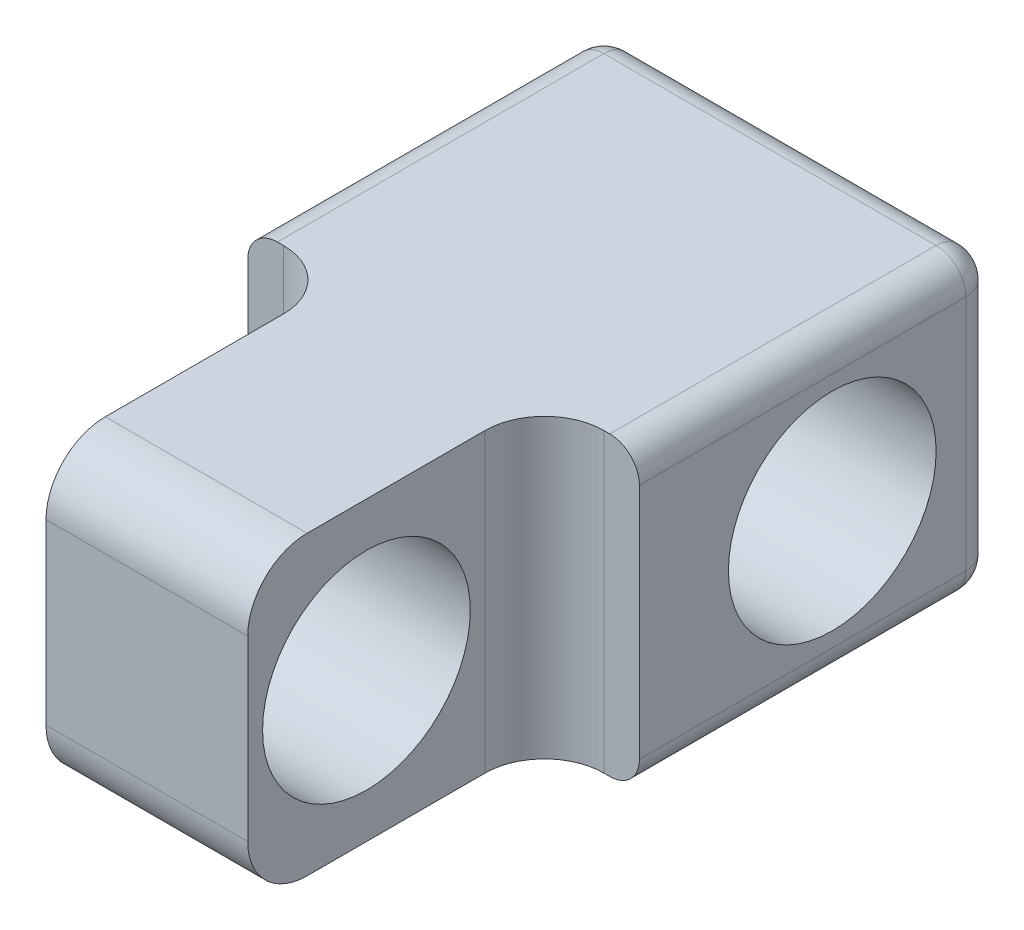
ISO-10303-21;
HEADER;
FILE_DESCRIPTION(('STEP AP214'),'2;1');
FILE_NAME('part.step','',(''),(''),'','','');
FILE_SCHEMA(('AUTOMOTIVE_DESIGN { 1 0 10303 214 1 1 1 1 }'));
ENDSEC;
DATA;
#1=APPLICATION_CONTEXT('core data for automotive mechanical design processes');
#2=APPLICATION_PROTOCOL_DEFINITION('international standard','automotive_design',2000,#1);
#3=PRODUCT_CONTEXT('',#1,'mechanical');
#4=PRODUCT('Part','Part','',(#3));
#5=PRODUCT_RELATED_PRODUCT_CATEGORY('part','',(#4));
#6=PRODUCT_DEFINITION_FORMATION('','',#4);
#7=PRODUCT_DEFINITION_CONTEXT('part definition',#1,'design');
#8=PRODUCT_DEFINITION('design','',#6,#7);
#9=PRODUCT_DEFINITION_SHAPE('','',#8);
#10=(LENGTH_UNIT() NAMED_UNIT(*) SI_UNIT(.MILLI.,.METRE.));
#11=(NAMED_UNIT(*) PLANE_ANGLE_UNIT() SI_UNIT($,.RADIAN.));
#12=(NAMED_UNIT(*) SI_UNIT($,.STERADIAN.) SOLID_ANGLE_UNIT());
#13=UNCERTAINTY_MEASURE_WITH_UNIT(LENGTH_MEASURE(1.E-05),#10,'distance_accuracy_value','');
#14=(GEOMETRIC_REPRESENTATION_CONTEXT(3) GLOBAL_UNCERTAINTY_ASSIGNED_CONTEXT((#13)) GLOBAL_UNIT_ASSIGNED_CONTEXT((#10,
#11,#12)) REPRESENTATION_CONTEXT('',''));
#15=CARTESIAN_POINT('',(0.,0.,0.));
#16=DIRECTION('',(0.,0.,1.));
#17=DIRECTION('',(1.,0.,0.));
#18=AXIS2_PLACEMENT_3D('',#15,#16,#17);
#19=CARTESIAN_POINT('',(6.1,4.5,6.));
#20=DIRECTION('',(0.,0.,-1.));
#21=DIRECTION('',(-1.,0.,0.));
#22=AXIS2_PLACEMENT_3D('',#19,#20,#21);
#23=PLANE('',#22);
#24=DIRECTION('',(-1.,0.,0.));
#25=VECTOR('',#24,1.);
#26=CARTESIAN_POINT('',(0.500000000000004,5.,6.));
#27=LINE('',#26,#25);
#28=CARTESIAN_POINT('',(6.1,5.,6.));
#29=VERTEX_POINT('',#28);
#30=CARTESIAN_POINT('',(6.,5.,6.));
#31=VERTEX_POINT('',#30);
#32=EDGE_CURVE('E160',#29,#31,#27,.T.);
#33=ORIENTED_EDGE('',*,*,#32,.T.);
#34=DIRECTION('',(0.,1.,0.));
#35=VECTOR('',#34,1.);
#36=CARTESIAN_POINT('',(6.,0.,6.));
#37=LINE('',#36,#35);
#38=CARTESIAN_POINT('',(6.,0.,6.));
#39=VERTEX_POINT('',#38);
#40=EDGE_CURVE('E243',#31,#39,#37,.F.);
#41=ORIENTED_EDGE('',*,*,#40,.T.);
#42=DIRECTION('',(1.,0.,0.));
#43=VECTOR('',#42,1.);
#44=CARTESIAN_POINT('',(0.500000000000004,0.,6.));
#45=LINE('',#44,#43);
#46=CARTESIAN_POINT('',(6.1,0.,6.));
#47=VERTEX_POINT('',#46);
#48=EDGE_CURVE('E309',#39,#47,#45,.T.);
#49=ORIENTED_EDGE('',*,*,#48,.T.);
#50=CARTESIAN_POINT('',(6.1,0.5,6.));
#51=DIRECTION('',(0.,0.,1.));
#52=DIRECTION('',(-1.,0.,0.));
#53=AXIS2_PLACEMENT_3D('',#50,#51,#52);
#54=CIRCLE('',#53,0.5);
#55=CARTESIAN_POINT('',(6.6,0.500000000000003,6.));
#56=VERTEX_POINT('',#55);
#57=EDGE_CURVE('E313',#47,#56,#54,.T.);
#58=ORIENTED_EDGE('',*,*,#57,.T.);
#59=DIRECTION('',(0.,1.,0.));
#60=VECTOR('',#59,1.);
#61=CARTESIAN_POINT('',(6.6,0.500000000000004,6.));
#62=LINE('',#61,#60);
#63=CARTESIAN_POINT('',(6.6,4.5,6.));
#64=VERTEX_POINT('',#63);
#65=EDGE_CURVE('E175',#56,#64,#62,.T.);
#66=ORIENTED_EDGE('',*,*,#65,.T.);
#67=CARTESIAN_POINT('',(6.1,4.5,6.));
#68=DIRECTION('',(0.,0.,1.));
#69=DIRECTION('',(-1.,0.,0.));
#70=AXIS2_PLACEMENT_3D('',#67,#68,#69);
#71=CIRCLE('',#70,0.5);
#72=EDGE_CURVE('E173',#64,#29,#71,.T.);
#73=ORIENTED_EDGE('',*,*,#72,.T.);
#74=EDGE_LOOP('',(#33,#41,#49,#58,#66,#73));
#75=FACE_BOUND('',#74,.T.);
#76=ADVANCED_FACE('F35',(#75),#23,.F.);
#77=CARTESIAN_POINT('',(0.500000000000004,0.,6.));
#78=VERTEX_POINT('',#77);
#79=CARTESIAN_POINT('',(0.599999999999999,0.,6.));
#80=VERTEX_POINT('',#79);
#81=EDGE_CURVE('E310',#78,#80,#45,.T.);
#82=ORIENTED_EDGE('',*,*,#81,.T.);
#83=DIRECTION('',(0.,-1.,0.));
#84=VECTOR('',#83,1.);
#85=CARTESIAN_POINT('',(0.599999999999999,5.,6.));
#86=LINE('',#85,#84);
#87=CARTESIAN_POINT('',(0.599999999999999,5.,6.));
#88=VERTEX_POINT('',#87);
#89=EDGE_CURVE('E248',#80,#88,#86,.F.);
#90=ORIENTED_EDGE('',*,*,#89,.T.);
#91=CARTESIAN_POINT('',(0.500000000000004,5.,6.));
#92=VERTEX_POINT('',#91);
#93=EDGE_CURVE('E170',#88,#92,#27,.T.);
#94=ORIENTED_EDGE('',*,*,#93,.T.);
#95=CARTESIAN_POINT('',(0.5,4.5,6.));
#96=DIRECTION('',(0.,0.,1.));
#97=DIRECTION('',(1.,0.,0.));
#98=AXIS2_PLACEMENT_3D('',#95,#96,#97);
#99=CIRCLE('',#98,0.5);
#100=CARTESIAN_POINT('',(0.,4.5,6.));
#101=VERTEX_POINT('',#100);
#102=EDGE_CURVE('E169',#92,#101,#99,.T.);
#103=ORIENTED_EDGE('',*,*,#102,.T.);
#104=DIRECTION('',(0.,-1.,0.));
#105=VECTOR('',#104,1.);
#106=CARTESIAN_POINT('',(0.,0.500000000000004,6.));
#107=LINE('',#106,#105);
#108=CARTESIAN_POINT('',(0.,0.500000000000004,6.));
#109=VERTEX_POINT('',#108);
#110=EDGE_CURVE('E305',#101,#109,#107,.T.);
#111=ORIENTED_EDGE('',*,*,#110,.T.);
#112=CARTESIAN_POINT('',(0.5,0.5,6.));
#113=DIRECTION('',(0.,0.,1.));
#114=DIRECTION('',(-1.,0.,0.));
#115=AXIS2_PLACEMENT_3D('',#112,#113,#114);
#116=CIRCLE('',#115,0.5);
#117=EDGE_CURVE('E307',#109,#78,#116,.T.);
#118=ORIENTED_EDGE('',*,*,#117,.T.);
#119=EDGE_LOOP('',(#82,#90,#94,#103,#111,#118));
#120=FACE_BOUND('',#119,.T.);
#121=ADVANCED_FACE('F366',(#120),#23,.F.);
#122=CARTESIAN_POINT('',(6.1,4.5,6.));
#123=DIRECTION('',(0.,0.,-1.));
#124=DIRECTION('',(-1.,0.,0.));
#125=AXIS2_PLACEMENT_3D('',#122,#123,#124);
#126=CYLINDRICAL_SURFACE('',#125,0.5);
#127=DIRECTION('',(0.,0.,-1.));
#128=VECTOR('',#127,1.);
#129=CARTESIAN_POINT('',(6.6,4.5,6.));
#130=LINE('',#129,#128);
#131=CARTESIAN_POINT('',(6.6,4.5,0.5));
#132=VERTEX_POINT('',#131);
#133=EDGE_CURVE('E316',#64,#132,#130,.T.);
#134=ORIENTED_EDGE('',*,*,#133,.T.);
#135=CARTESIAN_POINT('',(6.1,4.5,0.5));
#136=DIRECTION('',(0.,0.,-1.));
#137=DIRECTION('',(-1.,0.,0.));
#138=AXIS2_PLACEMENT_3D('',#135,#136,#137);
#139=CIRCLE('',#138,0.5);
#140=CARTESIAN_POINT('',(6.1,5.,0.5));
#141=VERTEX_POINT('',#140);
#142=EDGE_CURVE('E184',#132,#141,#139,.F.);
#143=ORIENTED_EDGE('',*,*,#142,.T.);
#144=DIRECTION('',(0.,0.,-1.));
#145=VECTOR('',#144,1.);
#146=CARTESIAN_POINT('',(6.1,5.,6.));
#147=LINE('',#146,#145);
#148=EDGE_CURVE('E164',#29,#141,#147,.T.);
#149=ORIENTED_EDGE('',*,*,#148,.F.);
#150=ORIENTED_EDGE('',*,*,#72,.F.);
#151=EDGE_LOOP('',(#134,#143,#149,#150));
#152=FACE_BOUND('',#151,.T.);
#153=ADVANCED_FACE('F182',(#152),#126,.T.);
#154=CARTESIAN_POINT('',(0.500000000000004,5.,6.));
#155=DIRECTION('',(0.,-1.,0.));
#156=DIRECTION('',(0.,0.,-1.));
#157=AXIS2_PLACEMENT_3D('',#154,#155,#156);
#158=PLANE('',#157);
#159=DIRECTION('',(0.,0.,-1.));
#160=VECTOR('',#159,1.);
#161=CARTESIAN_POINT('',(1.6,5.,11.));
#162=LINE('',#161,#160);
#163=CARTESIAN_POINT('',(1.6,5.,10.));
#164=VERTEX_POINT('',#163);
#165=CARTESIAN_POINT('',(1.6,5.,7.));
#166=VERTEX_POINT('',#165);
#167=EDGE_CURVE('E220',#164,#166,#162,.T.);
#168=ORIENTED_EDGE('',*,*,#167,.F.);
#169=DIRECTION('',(-1.,0.,0.));
#170=VECTOR('',#169,1.);
#171=CARTESIAN_POINT('',(0.500000000000004,5.,10.));
#172=LINE('',#171,#170);
#173=CARTESIAN_POINT('',(5.,5.,10.));
#174=VERTEX_POINT('',#173);
#175=EDGE_CURVE('E11',#164,#174,#172,.F.);
#176=ORIENTED_EDGE('',*,*,#175,.T.);
#177=DIRECTION('',(0.,0.,-1.));
#178=VECTOR('',#177,1.);
#179=CARTESIAN_POINT('',(5.,5.,11.));
#180=LINE('',#179,#178);
#181=CARTESIAN_POINT('',(5.,5.,7.));
#182=VERTEX_POINT('',#181);
#183=EDGE_CURVE('E293',#174,#182,#180,.T.);
#184=ORIENTED_EDGE('',*,*,#183,.T.);
#185=CARTESIAN_POINT('',(6.,5.,7.));
#186=DIRECTION('',(0.,-1.,0.));
#187=DIRECTION('',(0.,0.,-1.));
#188=AXIS2_PLACEMENT_3D('',#185,#186,#187);
#189=CIRCLE('',#188,1.);
#190=EDGE_CURVE('E166',#182,#31,#189,.T.);
#191=ORIENTED_EDGE('',*,*,#190,.T.);
#192=ORIENTED_EDGE('',*,*,#32,.F.);
#193=ORIENTED_EDGE('',*,*,#148,.T.);
#194=DIRECTION('',(-1.,0.,0.));
#195=VECTOR('',#194,1.);
#196=CARTESIAN_POINT('',(0.500000000000004,5.,0.5));
#197=LINE('',#196,#195);
#198=CARTESIAN_POINT('',(0.500000000000004,5.,0.5));
#199=VERTEX_POINT('',#198);
#200=EDGE_CURVE('E214',#141,#199,#197,.T.);
#201=ORIENTED_EDGE('',*,*,#200,.T.);
#202=DIRECTION('',(0.,0.,-1.));
#203=VECTOR('',#202,1.);
#204=CARTESIAN_POINT('',(0.500000000000004,5.,6.));
#205=LINE('',#204,#203);
#206=EDGE_CURVE('E185',#92,#199,#205,.T.);
#207=ORIENTED_EDGE('',*,*,#206,.F.);
#208=ORIENTED_EDGE('',*,*,#93,.F.);
#209=CARTESIAN_POINT('',(0.599999999999999,5.,7.));
#210=DIRECTION('',(0.,-1.,0.));
#211=DIRECTION('',(0.,0.,-1.));
#212=AXIS2_PLACEMENT_3D('',#209,#210,#211);
#213=CIRCLE('',#212,1.);
#214=EDGE_CURVE('E256',#88,#166,#213,.T.);
#215=ORIENTED_EDGE('',*,*,#214,.T.);
#216=EDGE_LOOP('',(#168,#176,#184,#191,#192,#193,#201,#207,#208,#215));
#217=FACE_BOUND('',#216,.T.);
#218=ADVANCED_FACE('F162',(#217),#158,.F.);
#219=CARTESIAN_POINT('',(0.5,4.5,6.));
#220=DIRECTION('',(0.,0.,-1.));
#221=DIRECTION('',(-1.,0.,0.));
#222=AXIS2_PLACEMENT_3D('',#219,#220,#221);
#223=CYLINDRICAL_SURFACE('',#222,0.5);
#224=ORIENTED_EDGE('',*,*,#206,.T.);
#225=CARTESIAN_POINT('',(0.5,4.5,0.5));
#226=DIRECTION('',(0.,0.,-1.));
#227=DIRECTION('',(-1.,0.,0.));
#228=AXIS2_PLACEMENT_3D('',#225,#226,#227);
#229=CIRCLE('',#228,0.5);
#230=CARTESIAN_POINT('',(0.,4.5,0.5));
#231=VERTEX_POINT('',#230);
#232=EDGE_CURVE('E212',#199,#231,#229,.F.);
#233=ORIENTED_EDGE('',*,*,#232,.T.);
#234=DIRECTION('',(0.,0.,-1.));
#235=VECTOR('',#234,1.);
#236=CARTESIAN_POINT('',(0.,4.5,6.));
#237=LINE('',#236,#235);
#238=EDGE_CURVE('E190',#101,#231,#237,.T.);
#239=ORIENTED_EDGE('',*,*,#238,.F.);
#240=ORIENTED_EDGE('',*,*,#102,.F.);
#241=EDGE_LOOP('',(#224,#233,#239,#240));
#242=FACE_BOUND('',#241,.T.);
#243=ADVANCED_FACE('F364',(#242),#223,.T.);
#244=CARTESIAN_POINT('',(0.,0.500000000000004,6.));
#245=DIRECTION('',(1.,0.,0.));
#246=DIRECTION('',(0.,0.,-1.));
#247=AXIS2_PLACEMENT_3D('',#244,#245,#246);
#248=PLANE('',#247);
#249=CARTESIAN_POINT('',(0.,2.5,2.75));
#250=DIRECTION('',(1.,0.,0.));
#251=DIRECTION('',(0.,0.,-1.));
#252=AXIS2_PLACEMENT_3D('',#249,#250,#251);
#253=CIRCLE('',#252,1.75);
#254=CARTESIAN_POINT('',(0.,2.5,1.));
#255=VERTEX_POINT('',#254);
#256=EDGE_CURVE('E179',#255,#255,#253,.T.);
#257=ORIENTED_EDGE('',*,*,#256,.T.);
#258=EDGE_LOOP('',(#257));
#259=FACE_BOUND('',#258,.T.);
#260=ORIENTED_EDGE('',*,*,#238,.T.);
#261=DIRECTION('',(0.,-1.,0.));
#262=VECTOR('',#261,1.);
#263=CARTESIAN_POINT('',(0.,0.500000000000004,0.5));
#264=LINE('',#263,#262);
#265=CARTESIAN_POINT('',(0.,0.500000000000004,0.5));
#266=VERTEX_POINT('',#265);
#267=EDGE_CURVE('E210',#231,#266,#264,.T.);
#268=ORIENTED_EDGE('',*,*,#267,.T.);
#269=DIRECTION('',(0.,0.,-1.));
#270=VECTOR('',#269,1.);
#271=CARTESIAN_POINT('',(0.,0.500000000000004,6.));
#272=LINE('',#271,#270);
#273=EDGE_CURVE('E327',#109,#266,#272,.T.);
#274=ORIENTED_EDGE('',*,*,#273,.F.);
#275=ORIENTED_EDGE('',*,*,#110,.F.);
#276=EDGE_LOOP('',(#260,#268,#274,#275));
#277=FACE_BOUND('',#276,.T.);
#278=ADVANCED_FACE('F334',(#259,#277),#248,.F.);
#279=CARTESIAN_POINT('',(0.5,0.5,6.));
#280=DIRECTION('',(0.,0.,-1.));
#281=DIRECTION('',(-1.,0.,0.));
#282=AXIS2_PLACEMENT_3D('',#279,#280,#281);
#283=CYLINDRICAL_SURFACE('',#282,0.5);
#284=ORIENTED_EDGE('',*,*,#273,.T.);
#285=CARTESIAN_POINT('',(0.5,0.5,0.5));
#286=DIRECTION('',(0.,0.,-1.));
#287=DIRECTION('',(-1.,0.,0.));
#288=AXIS2_PLACEMENT_3D('',#285,#286,#287);
#289=CIRCLE('',#288,0.5);
#290=CARTESIAN_POINT('',(0.500000000000004,0.,0.5));
#291=VERTEX_POINT('',#290);
#292=EDGE_CURVE('E208',#266,#291,#289,.F.);
#293=ORIENTED_EDGE('',*,*,#292,.T.);
#294=DIRECTION('',(0.,0.,-1.));
#295=VECTOR('',#294,1.);
#296=CARTESIAN_POINT('',(0.500000000000004,0.,6.));
#297=LINE('',#296,#295);
#298=EDGE_CURVE('E324',#78,#291,#297,.T.);
#299=ORIENTED_EDGE('',*,*,#298,.F.);
#300=ORIENTED_EDGE('',*,*,#117,.F.);
#301=EDGE_LOOP('',(#284,#293,#299,#300));
#302=FACE_BOUND('',#301,.T.);
#303=ADVANCED_FACE('F417',(#302),#283,.T.);
#304=CARTESIAN_POINT('',(0.500000000000004,0.,6.));
#305=DIRECTION('',(0.,1.,0.));
#306=DIRECTION('',(0.,0.,1.));
#307=AXIS2_PLACEMENT_3D('',#304,#305,#306);
#308=PLANE('',#307);
#309=DIRECTION('',(0.,0.,-1.));
#310=VECTOR('',#309,1.);
#311=CARTESIAN_POINT('',(5.,0.,11.));
#312=LINE('',#311,#310);
#313=CARTESIAN_POINT('',(5.,0.,10.));
#314=VERTEX_POINT('',#313);
#315=CARTESIAN_POINT('',(5.,0.,7.));
#316=VERTEX_POINT('',#315);
#317=EDGE_CURVE('E288',#314,#316,#312,.T.);
#318=ORIENTED_EDGE('',*,*,#317,.F.);
#319=DIRECTION('',(1.,0.,0.));
#320=VECTOR('',#319,1.);
#321=CARTESIAN_POINT('',(0.500000000000004,0.,10.));
#322=LINE('',#321,#320);
#323=CARTESIAN_POINT('',(1.6,0.,10.));
#324=VERTEX_POINT('',#323);
#325=EDGE_CURVE('E58',#314,#324,#322,.F.);
#326=ORIENTED_EDGE('',*,*,#325,.T.);
#327=DIRECTION('',(0.,0.,-1.));
#328=VECTOR('',#327,1.);
#329=CARTESIAN_POINT('',(1.6,0.,11.));
#330=LINE('',#329,#328);
#331=CARTESIAN_POINT('',(1.6,0.,7.));
#332=VERTEX_POINT('',#331);
#333=EDGE_CURVE('E274',#324,#332,#330,.T.);
#334=ORIENTED_EDGE('',*,*,#333,.T.);
#335=CARTESIAN_POINT('',(0.599999999999999,0.,7.));
#336=DIRECTION('',(0.,1.,0.));
#337=DIRECTION('',(0.,0.,1.));
#338=AXIS2_PLACEMENT_3D('',#335,#336,#337);
#339=CIRCLE('',#338,1.);
#340=EDGE_CURVE('E254',#332,#80,#339,.T.);
#341=ORIENTED_EDGE('',*,*,#340,.T.);
#342=ORIENTED_EDGE('',*,*,#81,.F.);
#343=ORIENTED_EDGE('',*,*,#298,.T.);
#344=DIRECTION('',(1.,0.,0.));
#345=VECTOR('',#344,1.);
#346=CARTESIAN_POINT('',(6.1,0.,0.5));
#347=LINE('',#346,#345);
#348=CARTESIAN_POINT('',(6.1,0.,0.5));
#349=VERTEX_POINT('',#348);
#350=EDGE_CURVE('E206',#291,#349,#347,.T.);
#351=ORIENTED_EDGE('',*,*,#350,.T.);
#352=DIRECTION('',(0.,0.,-1.));
#353=VECTOR('',#352,1.);
#354=CARTESIAN_POINT('',(6.1,0.,6.));
#355=LINE('',#354,#353);
#356=EDGE_CURVE('E321',#47,#349,#355,.T.);
#357=ORIENTED_EDGE('',*,*,#356,.F.);
#358=ORIENTED_EDGE('',*,*,#48,.F.);
#359=CARTESIAN_POINT('',(6.,0.,7.));
#360=DIRECTION('',(0.,1.,0.));
#361=DIRECTION('',(0.,0.,1.));
#362=AXIS2_PLACEMENT_3D('',#359,#360,#361);
#363=CIRCLE('',#362,1.);
#364=EDGE_CURVE('E251',#39,#316,#363,.T.);
#365=ORIENTED_EDGE('',*,*,#364,.T.);
#366=EDGE_LOOP('',(#318,#326,#334,#341,#342,#343,#351,#357,#358,#365));
#367=FACE_BOUND('',#366,.T.);
#368=ADVANCED_FACE('F289',(#367),#308,.F.);
#369=CARTESIAN_POINT('',(6.1,0.5,6.));
#370=DIRECTION('',(0.,0.,-1.));
#371=DIRECTION('',(-1.,0.,0.));
#372=AXIS2_PLACEMENT_3D('',#369,#370,#371);
#373=CYLINDRICAL_SURFACE('',#372,0.5);
#374=ORIENTED_EDGE('',*,*,#356,.T.);
#375=CARTESIAN_POINT('',(6.1,0.5,0.5));
#376=DIRECTION('',(0.,0.,-1.));
#377=DIRECTION('',(-1.,0.,0.));
#378=AXIS2_PLACEMENT_3D('',#375,#376,#377);
#379=CIRCLE('',#378,0.5);
#380=CARTESIAN_POINT('',(6.6,0.500000000000003,0.5));
#381=VERTEX_POINT('',#380);
#382=EDGE_CURVE('E204',#349,#381,#379,.F.);
#383=ORIENTED_EDGE('',*,*,#382,.T.);
#384=DIRECTION('',(0.,0.,-1.));
#385=VECTOR('',#384,1.);
#386=CARTESIAN_POINT('',(6.6,0.500000000000003,6.));
#387=LINE('',#386,#385);
#388=EDGE_CURVE('E318',#56,#381,#387,.T.);
#389=ORIENTED_EDGE('',*,*,#388,.F.);
#390=ORIENTED_EDGE('',*,*,#57,.F.);
#391=EDGE_LOOP('',(#374,#383,#389,#390));
#392=FACE_BOUND('',#391,.T.);
#393=ADVANCED_FACE('F410',(#392),#373,.T.);
#394=CARTESIAN_POINT('',(6.6,0.500000000000004,6.));
#395=DIRECTION('',(-1.,0.,0.));
#396=DIRECTION('',(0.,0.,1.));
#397=AXIS2_PLACEMENT_3D('',#394,#395,#396);
#398=PLANE('',#397);
#399=CARTESIAN_POINT('',(6.6,2.5,2.75));
#400=DIRECTION('',(1.,0.,0.));
#401=DIRECTION('',(0.,0.,-1.));
#402=AXIS2_PLACEMENT_3D('',#399,#400,#401);
#403=CIRCLE('',#402,1.75);
#404=CARTESIAN_POINT('',(6.6,2.5,1.));
#405=VERTEX_POINT('',#404);
#406=EDGE_CURVE('E240',#405,#405,#403,.T.);
#407=ORIENTED_EDGE('',*,*,#406,.F.);
#408=EDGE_LOOP('',(#407));
#409=FACE_BOUND('',#408,.T.);
#410=ORIENTED_EDGE('',*,*,#388,.T.);
#411=DIRECTION('',(0.,1.,0.));
#412=VECTOR('',#411,1.);
#413=CARTESIAN_POINT('',(6.6,4.5,0.5));
#414=LINE('',#413,#412);
#415=EDGE_CURVE('E187',#381,#132,#414,.T.);
#416=ORIENTED_EDGE('',*,*,#415,.T.);
#417=ORIENTED_EDGE('',*,*,#133,.F.);
#418=ORIENTED_EDGE('',*,*,#65,.F.);
#419=EDGE_LOOP('',(#410,#416,#417,#418));
#420=FACE_BOUND('',#419,.T.);
#421=ADVANCED_FACE('F407',(#409,#420),#398,.F.);
#422=CARTESIAN_POINT('',(6.1,4.5,0.));
#423=DIRECTION('',(0.,0.,-1.));
#424=DIRECTION('',(-1.,0.,0.));
#425=AXIS2_PLACEMENT_3D('',#422,#423,#424);
#426=PLANE('',#425);
#427=DIRECTION('',(-1.,0.,0.));
#428=VECTOR('',#427,1.);
#429=CARTESIAN_POINT('',(6.1,4.5,0.));
#430=LINE('',#429,#428);
#431=CARTESIAN_POINT('',(0.5,4.5,0.));
#432=VERTEX_POINT('',#431);
#433=CARTESIAN_POINT('',(6.1,4.5,0.));
#434=VERTEX_POINT('',#433);
#435=EDGE_CURVE('E195',#432,#434,#430,.F.);
#436=ORIENTED_EDGE('',*,*,#435,.T.);
#437=DIRECTION('',(0.,1.,0.));
#438=VECTOR('',#437,1.);
#439=CARTESIAN_POINT('',(6.1,0.500000000000003,0.));
#440=LINE('',#439,#438);
#441=CARTESIAN_POINT('',(6.1,0.5,0.));
#442=VERTEX_POINT('',#441);
#443=EDGE_CURVE('E201',#434,#442,#440,.F.);
#444=ORIENTED_EDGE('',*,*,#443,.T.);
#445=DIRECTION('',(1.,0.,0.));
#446=VECTOR('',#445,1.);
#447=CARTESIAN_POINT('',(0.500000000000004,0.5,0.));
#448=LINE('',#447,#446);
#449=CARTESIAN_POINT('',(0.5,0.5,0.));
#450=VERTEX_POINT('',#449);
#451=EDGE_CURVE('E199',#442,#450,#448,.F.);
#452=ORIENTED_EDGE('',*,*,#451,.T.);
#453=DIRECTION('',(0.,-1.,0.));
#454=VECTOR('',#453,1.);
#455=CARTESIAN_POINT('',(0.5,4.5,0.));
#456=LINE('',#455,#454);
#457=EDGE_CURVE('E197',#450,#432,#456,.F.);
#458=ORIENTED_EDGE('',*,*,#457,.T.);
#459=EDGE_LOOP('',(#436,#444,#452,#458));
#460=FACE_BOUND('',#459,.T.);
#461=ADVANCED_FACE('F354',(#460),#426,.T.);
#462=CARTESIAN_POINT('',(0.,2.5,2.75));
#463=DIRECTION('',(1.,0.,0.));
#464=DIRECTION('',(0.,0.,-1.));
#465=AXIS2_PLACEMENT_3D('',#462,#463,#464);
#466=CYLINDRICAL_SURFACE('',#465,1.75);
#467=ORIENTED_EDGE('',*,*,#256,.F.);
#468=EDGE_LOOP('',(#467));
#469=FACE_BOUND('',#468,.T.);
#470=ORIENTED_EDGE('',*,*,#406,.T.);
#471=EDGE_LOOP('',(#470));
#472=FACE_BOUND('',#471,.T.);
#473=ADVANCED_FACE('F404',(#469,#472),#466,.F.);
#474=CARTESIAN_POINT('',(0.5,0.5,0.5));
#475=DIRECTION('',(0.,0.,-1.));
#476=DIRECTION('',(-1.,0.,0.));
#477=AXIS2_PLACEMENT_3D('',#474,#475,#476);
#478=SPHERICAL_SURFACE('',#477,0.5);
#479=CARTESIAN_POINT('',(0.5,0.5,0.5));
#480=DIRECTION('',(0.,1.,0.));
#481=DIRECTION('',(-1.,0.,0.));
#482=AXIS2_PLACEMENT_3D('',#479,#480,#481);
#483=CIRCLE('',#482,0.5);
#484=EDGE_CURVE('E234',#450,#266,#483,.T.);
#485=ORIENTED_EDGE('',*,*,#484,.F.);
#486=CARTESIAN_POINT('',(0.5,0.5,0.5));
#487=DIRECTION('',(1.,0.,0.));
#488=DIRECTION('',(0.,1.,0.));
#489=AXIS2_PLACEMENT_3D('',#486,#487,#488);
#490=CIRCLE('',#489,0.5);
#491=EDGE_CURVE('E237',#291,#450,#490,.T.);
#492=ORIENTED_EDGE('',*,*,#491,.F.);
#493=ORIENTED_EDGE('',*,*,#292,.F.);
#494=EDGE_LOOP('',(#485,#492,#493));
#495=FACE_BOUND('',#494,.T.);
#496=ADVANCED_FACE('F447',(#495),#478,.T.);
#497=CARTESIAN_POINT('',(0.500000000000004,0.5,0.5));
#498=DIRECTION('',(-1.,0.,0.));
#499=DIRECTION('',(0.,0.,1.));
#500=AXIS2_PLACEMENT_3D('',#497,#498,#499);
#501=CYLINDRICAL_SURFACE('',#500,0.5);
#502=ORIENTED_EDGE('',*,*,#491,.T.);
#503=ORIENTED_EDGE('',*,*,#451,.F.);
#504=CARTESIAN_POINT('',(6.1,0.5,0.5));
#505=DIRECTION('',(1.,0.,0.));
#506=DIRECTION('',(0.,0.,-1.));
#507=AXIS2_PLACEMENT_3D('',#504,#505,#506);
#508=CIRCLE('',#507,0.5);
#509=EDGE_CURVE('E231',#349,#442,#508,.T.);
#510=ORIENTED_EDGE('',*,*,#509,.F.);
#511=ORIENTED_EDGE('',*,*,#350,.F.);
#512=EDGE_LOOP('',(#502,#503,#510,#511));
#513=FACE_BOUND('',#512,.T.);
#514=ADVANCED_FACE('F444',(#513),#501,.T.);
#515=CARTESIAN_POINT('',(0.5,0.500000000000004,0.5));
#516=DIRECTION('',(0.,1.,0.));
#517=DIRECTION('',(0.,0.,1.));
#518=AXIS2_PLACEMENT_3D('',#515,#516,#517);
#519=CYLINDRICAL_SURFACE('',#518,0.5);
#520=ORIENTED_EDGE('',*,*,#484,.T.);
#521=ORIENTED_EDGE('',*,*,#267,.F.);
#522=CARTESIAN_POINT('',(0.5,4.5,0.5));
#523=DIRECTION('',(0.,1.,0.));
#524=DIRECTION('',(0.,0.,1.));
#525=AXIS2_PLACEMENT_3D('',#522,#523,#524);
#526=CIRCLE('',#525,0.5);
#527=EDGE_CURVE('E228',#432,#231,#526,.T.);
#528=ORIENTED_EDGE('',*,*,#527,.F.);
#529=ORIENTED_EDGE('',*,*,#457,.F.);
#530=EDGE_LOOP('',(#520,#521,#528,#529));
#531=FACE_BOUND('',#530,.T.);
#532=ADVANCED_FACE('F340',(#531),#519,.T.);
#533=CARTESIAN_POINT('',(6.1,0.5,0.5));
#534=DIRECTION('',(0.,0.,-1.));
#535=DIRECTION('',(-1.,0.,0.));
#536=AXIS2_PLACEMENT_3D('',#533,#534,#535);
#537=SPHERICAL_SURFACE('',#536,0.5);
#538=ORIENTED_EDGE('',*,*,#382,.F.);
#539=ORIENTED_EDGE('',*,*,#509,.T.);
#540=CARTESIAN_POINT('',(6.1,0.5,0.5));
#541=DIRECTION('',(0.,1.,0.));
#542=DIRECTION('',(-1.,0.,0.));
#543=AXIS2_PLACEMENT_3D('',#540,#541,#542);
#544=CIRCLE('',#543,0.5);
#545=EDGE_CURVE('E226',#381,#442,#544,.T.);
#546=ORIENTED_EDGE('',*,*,#545,.F.);
#547=EDGE_LOOP('',(#538,#539,#546));
#548=FACE_BOUND('',#547,.T.);
#549=ADVANCED_FACE('F438',(#548),#537,.T.);
#550=CARTESIAN_POINT('',(0.5,4.5,0.5));
#551=DIRECTION('',(0.,0.,-1.));
#552=DIRECTION('',(-1.,0.,0.));
#553=AXIS2_PLACEMENT_3D('',#550,#551,#552);
#554=SPHERICAL_SURFACE('',#553,0.5);
#555=ORIENTED_EDGE('',*,*,#527,.T.);
#556=ORIENTED_EDGE('',*,*,#232,.F.);
#557=CARTESIAN_POINT('',(0.5,4.5,0.5));
#558=DIRECTION('',(1.,0.,0.));
#559=DIRECTION('',(0.,1.,0.));
#560=AXIS2_PLACEMENT_3D('',#557,#558,#559);
#561=CIRCLE('',#560,0.5);
#562=EDGE_CURVE('E223',#432,#199,#561,.T.);
#563=ORIENTED_EDGE('',*,*,#562,.F.);
#564=EDGE_LOOP('',(#555,#556,#563));
#565=FACE_BOUND('',#564,.T.);
#566=ADVANCED_FACE('F346',(#565),#554,.T.);
#567=CARTESIAN_POINT('',(6.1,0.500000000000004,0.5));
#568=DIRECTION('',(0.,-1.,0.));
#569=DIRECTION('',(0.,0.,-1.));
#570=AXIS2_PLACEMENT_3D('',#567,#568,#569);
#571=CYLINDRICAL_SURFACE('',#570,0.5);
#572=ORIENTED_EDGE('',*,*,#545,.T.);
#573=ORIENTED_EDGE('',*,*,#443,.F.);
#574=CARTESIAN_POINT('',(6.1,4.5,0.5));
#575=DIRECTION('',(0.,1.,0.));
#576=DIRECTION('',(0.,0.,1.));
#577=AXIS2_PLACEMENT_3D('',#574,#575,#576);
#578=CIRCLE('',#577,0.5);
#579=EDGE_CURVE('E219',#132,#434,#578,.T.);
#580=ORIENTED_EDGE('',*,*,#579,.F.);
#581=ORIENTED_EDGE('',*,*,#415,.F.);
#582=EDGE_LOOP('',(#572,#573,#580,#581));
#583=FACE_BOUND('',#582,.T.);
#584=ADVANCED_FACE('F357',(#583),#571,.T.);
#585=CARTESIAN_POINT('',(0.500000000000004,4.5,0.5));
#586=DIRECTION('',(1.,0.,0.));
#587=DIRECTION('',(0.,0.,-1.));
#588=AXIS2_PLACEMENT_3D('',#585,#586,#587);
#589=CYLINDRICAL_SURFACE('',#588,0.5);
#590=ORIENTED_EDGE('',*,*,#562,.T.);
#591=ORIENTED_EDGE('',*,*,#200,.F.);
#592=CARTESIAN_POINT('',(6.1,4.5,0.5));
#593=DIRECTION('',(1.,0.,0.));
#594=DIRECTION('',(0.,1.,0.));
#595=AXIS2_PLACEMENT_3D('',#592,#593,#594);
#596=CIRCLE('',#595,0.5);
#597=EDGE_CURVE('E217',#434,#141,#596,.T.);
#598=ORIENTED_EDGE('',*,*,#597,.F.);
#599=ORIENTED_EDGE('',*,*,#435,.F.);
#600=EDGE_LOOP('',(#590,#591,#598,#599));
#601=FACE_BOUND('',#600,.T.);
#602=ADVANCED_FACE('F351',(#601),#589,.T.);
#603=CARTESIAN_POINT('',(6.1,4.5,0.5));
#604=DIRECTION('',(0.,0.,-1.));
#605=DIRECTION('',(-1.,0.,0.));
#606=AXIS2_PLACEMENT_3D('',#603,#604,#605);
#607=SPHERICAL_SURFACE('',#606,0.5);
#608=ORIENTED_EDGE('',*,*,#142,.F.);
#609=ORIENTED_EDGE('',*,*,#579,.T.);
#610=ORIENTED_EDGE('',*,*,#597,.T.);
#611=EDGE_LOOP('',(#608,#609,#610));
#612=FACE_BOUND('',#611,.T.);
#613=ADVANCED_FACE('F361',(#612),#607,.T.);
#614=CARTESIAN_POINT('',(1.6,0.,11.));
#615=DIRECTION('',(1.,0.,0.));
#616=DIRECTION('',(0.,1.,0.));
#617=AXIS2_PLACEMENT_3D('',#614,#615,#616);
#618=PLANE('',#617);
#619=CARTESIAN_POINT('',(1.6,2.5,9.));
#620=DIRECTION('',(1.,0.,0.));
#621=DIRECTION('',(0.,1.,0.));
#622=AXIS2_PLACEMENT_3D('',#619,#620,#621);
#623=CIRCLE('',#622,1.75);
#624=CARTESIAN_POINT('',(1.6,4.25,9.));
#625=VERTEX_POINT('',#624);
#626=EDGE_CURVE('E283',#625,#625,#623,.T.);
#627=ORIENTED_EDGE('',*,*,#626,.T.);
#628=EDGE_LOOP('',(#627));
#629=FACE_BOUND('',#628,.T.);
#630=ORIENTED_EDGE('',*,*,#333,.F.);
#631=CARTESIAN_POINT('',(1.6,1.,10.));
#632=DIRECTION('',(1.,0.,0.));
#633=DIRECTION('',(0.,1.,0.));
#634=AXIS2_PLACEMENT_3D('',#631,#632,#633);
#635=CIRCLE('',#634,1.);
#636=CARTESIAN_POINT('',(1.6,1.,11.));
#637=VERTEX_POINT('',#636);
#638=EDGE_CURVE('E43',#324,#637,#635,.F.);
#639=ORIENTED_EDGE('',*,*,#638,.T.);
#640=DIRECTION('',(0.,-1.,0.));
#641=VECTOR('',#640,1.);
#642=CARTESIAN_POINT('',(1.6,0.,11.));
#643=LINE('',#642,#641);
#644=CARTESIAN_POINT('',(1.6,4.,11.));
#645=VERTEX_POINT('',#644);
#646=EDGE_CURVE('E273',#645,#637,#643,.T.);
#647=ORIENTED_EDGE('',*,*,#646,.F.);
#648=CARTESIAN_POINT('',(1.6,4.,10.));
#649=DIRECTION('',(1.,0.,0.));
#650=DIRECTION('',(0.,1.,0.));
#651=AXIS2_PLACEMENT_3D('',#648,#649,#650);
#652=CIRCLE('',#651,1.);
#653=EDGE_CURVE('E50',#645,#164,#652,.F.);
#654=ORIENTED_EDGE('',*,*,#653,.T.);
#655=ORIENTED_EDGE('',*,*,#167,.T.);
#656=DIRECTION('',(0.,-1.,0.));
#657=VECTOR('',#656,1.);
#658=CARTESIAN_POINT('',(1.6,0.,7.));
#659=LINE('',#658,#657);
#660=EDGE_CURVE('E245',#166,#332,#659,.T.);
#661=ORIENTED_EDGE('',*,*,#660,.T.);
#662=EDGE_LOOP('',(#630,#639,#647,#654,#655,#661));
#663=FACE_BOUND('',#662,.T.);
#664=ADVANCED_FACE('F272',(#629,#663),#618,.F.);
#665=CARTESIAN_POINT('',(5.,5.,11.));
#666=DIRECTION('',(-1.,0.,0.));
#667=DIRECTION('',(0.,-1.,0.));
#668=AXIS2_PLACEMENT_3D('',#665,#666,#667);
#669=PLANE('',#668);
#670=CARTESIAN_POINT('',(5.,2.5,9.));
#671=DIRECTION('',(1.,0.,0.));
#672=DIRECTION('',(0.,1.,0.));
#673=AXIS2_PLACEMENT_3D('',#670,#671,#672);
#674=CIRCLE('',#673,1.75);
#675=CARTESIAN_POINT('',(5.,4.25,9.));
#676=VERTEX_POINT('',#675);
#677=EDGE_CURVE('E380',#676,#676,#674,.T.);
#678=ORIENTED_EDGE('',*,*,#677,.F.);
#679=EDGE_LOOP('',(#678));
#680=FACE_BOUND('',#679,.T.);
#681=DIRECTION('',(0.,1.,0.));
#682=VECTOR('',#681,1.);
#683=CARTESIAN_POINT('',(5.,5.,11.));
#684=LINE('',#683,#682);
#685=CARTESIAN_POINT('',(5.,1.,11.));
#686=VERTEX_POINT('',#685);
#687=CARTESIAN_POINT('',(5.,4.,11.));
#688=VERTEX_POINT('',#687);
#689=EDGE_CURVE('E282',#686,#688,#684,.T.);
#690=ORIENTED_EDGE('',*,*,#689,.F.);
#691=CARTESIAN_POINT('',(5.,1.,10.));
#692=DIRECTION('',(-1.,0.,0.));
#693=DIRECTION('',(0.,-1.,0.));
#694=AXIS2_PLACEMENT_3D('',#691,#692,#693);
#695=CIRCLE('',#694,1.);
#696=EDGE_CURVE('E267',#686,#314,#695,.F.);
#697=ORIENTED_EDGE('',*,*,#696,.T.);
#698=ORIENTED_EDGE('',*,*,#317,.T.);
#699=DIRECTION('',(0.,1.,0.));
#700=VECTOR('',#699,1.);
#701=CARTESIAN_POINT('',(5.,5.,7.));
#702=LINE('',#701,#700);
#703=EDGE_CURVE('E216',#316,#182,#702,.T.);
#704=ORIENTED_EDGE('',*,*,#703,.T.);
#705=ORIENTED_EDGE('',*,*,#183,.F.);
#706=CARTESIAN_POINT('',(5.,4.,10.));
#707=DIRECTION('',(-1.,0.,0.));
#708=DIRECTION('',(0.,-1.,0.));
#709=AXIS2_PLACEMENT_3D('',#706,#707,#708);
#710=CIRCLE('',#709,1.);
#711=EDGE_CURVE('E265',#174,#688,#710,.F.);
#712=ORIENTED_EDGE('',*,*,#711,.T.);
#713=EDGE_LOOP('',(#690,#697,#698,#704,#705,#712));
#714=FACE_BOUND('',#713,.T.);
#715=ADVANCED_FACE('F287',(#680,#714),#669,.F.);
#716=CARTESIAN_POINT('',(0.,0.,11.));
#717=DIRECTION('',(0.,0.,-1.));
#718=DIRECTION('',(-1.,0.,0.));
#719=AXIS2_PLACEMENT_3D('',#716,#717,#718);
#720=PLANE('',#719);
#721=ORIENTED_EDGE('',*,*,#646,.T.);
#722=DIRECTION('',(1.,0.,0.));
#723=VECTOR('',#722,1.);
#724=CARTESIAN_POINT('',(0.,1.,11.));
#725=LINE('',#724,#723);
#726=EDGE_CURVE('E262',#637,#686,#725,.T.);
#727=ORIENTED_EDGE('',*,*,#726,.T.);
#728=ORIENTED_EDGE('',*,*,#689,.T.);
#729=DIRECTION('',(-1.,0.,0.));
#730=VECTOR('',#729,1.);
#731=CARTESIAN_POINT('',(0.,4.,11.));
#732=LINE('',#731,#730);
#733=EDGE_CURVE('E259',#688,#645,#732,.T.);
#734=ORIENTED_EDGE('',*,*,#733,.T.);
#735=EDGE_LOOP('',(#721,#727,#728,#734));
#736=FACE_BOUND('',#735,.T.);
#737=ADVANCED_FACE('F278',(#736),#720,.F.);
#738=CARTESIAN_POINT('',(6.,5.,7.));
#739=DIRECTION('',(0.,-1.,0.));
#740=DIRECTION('',(1.,0.,0.));
#741=AXIS2_PLACEMENT_3D('',#738,#739,#740);
#742=CYLINDRICAL_SURFACE('',#741,1.);
#743=ORIENTED_EDGE('',*,*,#364,.F.);
#744=ORIENTED_EDGE('',*,*,#40,.F.);
#745=ORIENTED_EDGE('',*,*,#190,.F.);
#746=ORIENTED_EDGE('',*,*,#703,.F.);
#747=EDGE_LOOP('',(#743,#744,#745,#746));
#748=FACE_BOUND('',#747,.T.);
#749=ADVANCED_FACE('F393',(#748),#742,.F.);
#750=CARTESIAN_POINT('',(0.599999999999999,0.,7.));
#751=DIRECTION('',(0.,1.,0.));
#752=DIRECTION('',(-1.,0.,0.));
#753=AXIS2_PLACEMENT_3D('',#750,#751,#752);
#754=CYLINDRICAL_SURFACE('',#753,1.);
#755=ORIENTED_EDGE('',*,*,#214,.F.);
#756=ORIENTED_EDGE('',*,*,#89,.F.);
#757=ORIENTED_EDGE('',*,*,#340,.F.);
#758=ORIENTED_EDGE('',*,*,#660,.F.);
#759=EDGE_LOOP('',(#755,#756,#757,#758));
#760=FACE_BOUND('',#759,.T.);
#761=ADVANCED_FACE('F371',(#760),#754,.F.);
#762=CARTESIAN_POINT('',(0.999999999999999,2.5,9.));
#763=DIRECTION('',(1.,0.,0.));
#764=DIRECTION('',(0.,1.,0.));
#765=AXIS2_PLACEMENT_3D('',#762,#763,#764);
#766=CYLINDRICAL_SURFACE('',#765,1.75);
#767=ORIENTED_EDGE('',*,*,#677,.T.);
#768=EDGE_LOOP('',(#767));
#769=FACE_BOUND('',#768,.T.);
#770=ORIENTED_EDGE('',*,*,#626,.F.);
#771=EDGE_LOOP('',(#770));
#772=FACE_BOUND('',#771,.T.);
#773=ADVANCED_FACE('F384',(#769,#772),#766,.F.);
#774=CARTESIAN_POINT('',(0.,1.,10.));
#775=DIRECTION('',(1.,0.,0.));
#776=DIRECTION('',(0.,0.,-1.));
#777=AXIS2_PLACEMENT_3D('',#774,#775,#776);
#778=CYLINDRICAL_SURFACE('',#777,1.);
#779=ORIENTED_EDGE('',*,*,#638,.F.);
#780=ORIENTED_EDGE('',*,*,#325,.F.);
#781=ORIENTED_EDGE('',*,*,#696,.F.);
#782=ORIENTED_EDGE('',*,*,#726,.F.);
#783=EDGE_LOOP('',(#779,#780,#781,#782));
#784=FACE_BOUND('',#783,.T.);
#785=ADVANCED_FACE('F285',(#784),#778,.T.);
#786=CARTESIAN_POINT('',(0.,4.,10.));
#787=DIRECTION('',(-1.,0.,0.));
#788=DIRECTION('',(0.,0.,1.));
#789=AXIS2_PLACEMENT_3D('',#786,#787,#788);
#790=CYLINDRICAL_SURFACE('',#789,1.);
#791=ORIENTED_EDGE('',*,*,#711,.F.);
#792=ORIENTED_EDGE('',*,*,#175,.F.);
#793=ORIENTED_EDGE('',*,*,#653,.F.);
#794=ORIENTED_EDGE('',*,*,#733,.F.);
#795=EDGE_LOOP('',(#791,#792,#793,#794));
#796=FACE_BOUND('',#795,.T.);
#797=ADVANCED_FACE('F37',(#796),#790,.T.);
#798=CLOSED_SHELL('',(#76,#121,#153,#218,#243,#278,#303,#368,#393,#421,#461,#473,#496,#514,#532,
#549,#566,#584,#602,#613,#664,#715,#737,#749,#761,#773,#785,#797));
#799=MANIFOLD_SOLID_BREP('B2',#798);
#800=ADVANCED_BREP_SHAPE_REPRESENTATION('',(#18,#799),#14);
#801=SHAPE_DEFINITION_REPRESENTATION(#9,#800);
ENDSEC;
END-ISO-10303-21;
